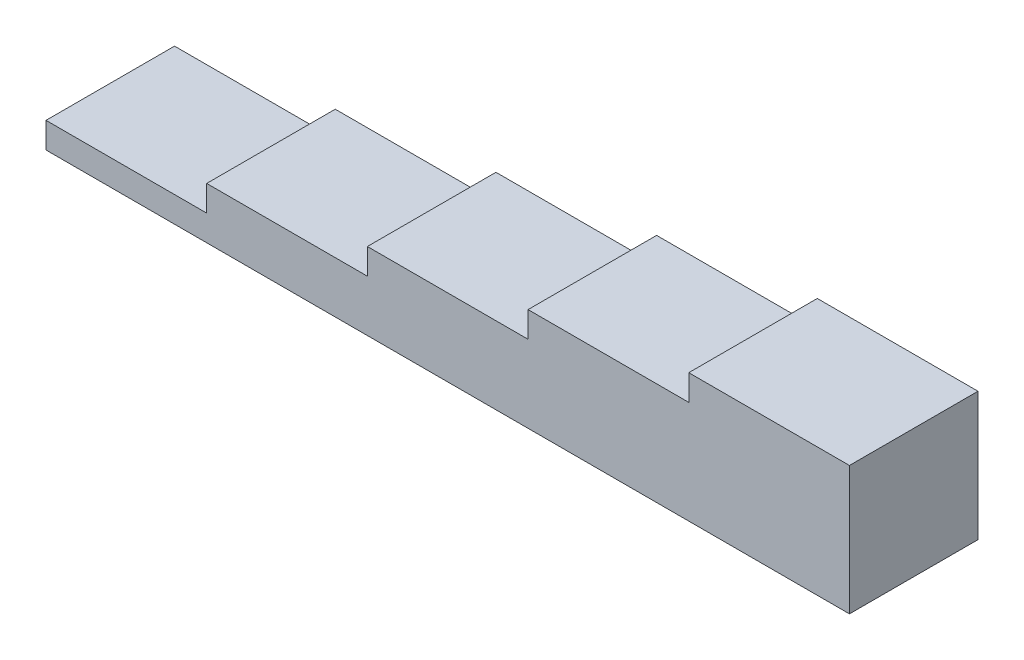
ISO-10303-21;
HEADER;
FILE_DESCRIPTION(('STEP AP214'),'2;1');
FILE_NAME('part.step','',(''),(''),'','','');
FILE_SCHEMA(('AUTOMOTIVE_DESIGN { 1 0 10303 214 1 1 1 1 }'));
ENDSEC;
DATA;
#1=APPLICATION_CONTEXT('core data for automotive mechanical design processes');
#2=APPLICATION_PROTOCOL_DEFINITION('international standard','automotive_design',2000,#1);
#3=PRODUCT_CONTEXT('',#1,'mechanical');
#4=PRODUCT('Part','Part','',(#3));
#5=PRODUCT_RELATED_PRODUCT_CATEGORY('part','',(#4));
#6=PRODUCT_DEFINITION_FORMATION('','',#4);
#7=PRODUCT_DEFINITION_CONTEXT('part definition',#1,'design');
#8=PRODUCT_DEFINITION('design','',#6,#7);
#9=PRODUCT_DEFINITION_SHAPE('','',#8);
#10=(LENGTH_UNIT() NAMED_UNIT(*) SI_UNIT(.MILLI.,.METRE.));
#11=(NAMED_UNIT(*) PLANE_ANGLE_UNIT() SI_UNIT($,.RADIAN.));
#12=(NAMED_UNIT(*) SI_UNIT($,.STERADIAN.) SOLID_ANGLE_UNIT());
#13=UNCERTAINTY_MEASURE_WITH_UNIT(LENGTH_MEASURE(1.E-05),#10,'distance_accuracy_value','');
#14=(GEOMETRIC_REPRESENTATION_CONTEXT(3) GLOBAL_UNCERTAINTY_ASSIGNED_CONTEXT((#13)) GLOBAL_UNIT_ASSIGNED_CONTEXT((#10,
#11,#12)) REPRESENTATION_CONTEXT('',''));
#15=CARTESIAN_POINT('',(0.,0.,0.));
#16=DIRECTION('',(0.,0.,1.));
#17=DIRECTION('',(1.,0.,0.));
#18=AXIS2_PLACEMENT_3D('',#15,#16,#17);
#19=CARTESIAN_POINT('',(1250.,200.,200.));
#20=DIRECTION('',(1.,0.,0.));
#21=DIRECTION('',(0.,0.,-1.));
#22=AXIS2_PLACEMENT_3D('',#19,#20,#21);
#23=PLANE('',#22);
#24=DIRECTION('',(0.,-1.,0.));
#25=VECTOR('',#24,1.);
#26=CARTESIAN_POINT('',(1250.,200.,0.));
#27=LINE('',#26,#25);
#28=CARTESIAN_POINT('',(1250.,200.,0.));
#29=VERTEX_POINT('',#28);
#30=CARTESIAN_POINT('',(1250.,0.,0.));
#31=VERTEX_POINT('',#30);
#32=EDGE_CURVE('E156',#29,#31,#27,.T.);
#33=ORIENTED_EDGE('',*,*,#32,.F.);
#34=DIRECTION('',(0.,0.,-1.));
#35=VECTOR('',#34,1.);
#36=CARTESIAN_POINT('',(1250.,200.,200.));
#37=LINE('',#36,#35);
#38=CARTESIAN_POINT('',(1250.,200.,200.));
#39=VERTEX_POINT('',#38);
#40=EDGE_CURVE('E11',#39,#29,#37,.T.);
#41=ORIENTED_EDGE('',*,*,#40,.F.);
#42=DIRECTION('',(0.,-1.,0.));
#43=VECTOR('',#42,1.);
#44=CARTESIAN_POINT('',(1250.,200.,200.));
#45=LINE('',#44,#43);
#46=CARTESIAN_POINT('',(1250.,0.,200.));
#47=VERTEX_POINT('',#46);
#48=EDGE_CURVE('E188',#39,#47,#45,.T.);
#49=ORIENTED_EDGE('',*,*,#48,.T.);
#50=DIRECTION('',(0.,0.,-1.));
#51=VECTOR('',#50,1.);
#52=CARTESIAN_POINT('',(1250.,0.,200.));
#53=LINE('',#52,#51);
#54=EDGE_CURVE('E38',#47,#31,#53,.T.);
#55=ORIENTED_EDGE('',*,*,#54,.T.);
#56=EDGE_LOOP('',(#33,#41,#49,#55));
#57=FACE_BOUND('',#56,.T.);
#58=ADVANCED_FACE('F35',(#57),#23,.T.);
#59=CARTESIAN_POINT('',(1000.,200.,200.));
#60=DIRECTION('',(0.,1.,0.));
#61=DIRECTION('',(0.,0.,1.));
#62=AXIS2_PLACEMENT_3D('',#59,#60,#61);
#63=PLANE('',#62);
#64=DIRECTION('',(1.,0.,0.));
#65=VECTOR('',#64,1.);
#66=CARTESIAN_POINT('',(1000.,200.,0.));
#67=LINE('',#66,#65);
#68=CARTESIAN_POINT('',(1000.,200.,0.));
#69=VERTEX_POINT('',#68);
#70=EDGE_CURVE('E186',#69,#29,#67,.T.);
#71=ORIENTED_EDGE('',*,*,#70,.F.);
#72=DIRECTION('',(0.,0.,-1.));
#73=VECTOR('',#72,1.);
#74=CARTESIAN_POINT('',(1000.,200.,200.));
#75=LINE('',#74,#73);
#76=CARTESIAN_POINT('',(1000.,200.,200.));
#77=VERTEX_POINT('',#76);
#78=EDGE_CURVE('E44',#77,#69,#75,.T.);
#79=ORIENTED_EDGE('',*,*,#78,.F.);
#80=DIRECTION('',(1.,0.,0.));
#81=VECTOR('',#80,1.);
#82=CARTESIAN_POINT('',(1000.,200.,200.));
#83=LINE('',#82,#81);
#84=EDGE_CURVE('E146',#77,#39,#83,.T.);
#85=ORIENTED_EDGE('',*,*,#84,.T.);
#86=ORIENTED_EDGE('',*,*,#40,.T.);
#87=EDGE_LOOP('',(#71,#79,#85,#86));
#88=FACE_BOUND('',#87,.T.);
#89=ADVANCED_FACE('F208',(#88),#63,.T.);
#90=CARTESIAN_POINT('',(1000.,160.,200.));
#91=DIRECTION('',(-1.,0.,0.));
#92=DIRECTION('',(0.,0.,1.));
#93=AXIS2_PLACEMENT_3D('',#90,#91,#92);
#94=PLANE('',#93);
#95=DIRECTION('',(0.,1.,0.));
#96=VECTOR('',#95,1.);
#97=CARTESIAN_POINT('',(1000.,160.,0.));
#98=LINE('',#97,#96);
#99=CARTESIAN_POINT('',(1000.,160.,0.));
#100=VERTEX_POINT('',#99);
#101=EDGE_CURVE('E133',#100,#69,#98,.T.);
#102=ORIENTED_EDGE('',*,*,#101,.F.);
#103=DIRECTION('',(0.,0.,-1.));
#104=VECTOR('',#103,1.);
#105=CARTESIAN_POINT('',(1000.,160.,200.));
#106=LINE('',#105,#104);
#107=CARTESIAN_POINT('',(1000.,160.,200.));
#108=VERTEX_POINT('',#107);
#109=EDGE_CURVE('E128',#108,#100,#106,.T.);
#110=ORIENTED_EDGE('',*,*,#109,.F.);
#111=DIRECTION('',(0.,1.,0.));
#112=VECTOR('',#111,1.);
#113=CARTESIAN_POINT('',(1000.,160.,200.));
#114=LINE('',#113,#112);
#115=EDGE_CURVE('E131',#108,#77,#114,.T.);
#116=ORIENTED_EDGE('',*,*,#115,.T.);
#117=ORIENTED_EDGE('',*,*,#78,.T.);
#118=EDGE_LOOP('',(#102,#110,#116,#117));
#119=FACE_BOUND('',#118,.T.);
#120=ADVANCED_FACE('F130',(#119),#94,.T.);
#121=CARTESIAN_POINT('',(750.,160.,200.));
#122=DIRECTION('',(0.,1.,0.));
#123=DIRECTION('',(0.,0.,1.));
#124=AXIS2_PLACEMENT_3D('',#121,#122,#123);
#125=PLANE('',#124);
#126=DIRECTION('',(1.,0.,0.));
#127=VECTOR('',#126,1.);
#128=CARTESIAN_POINT('',(750.,160.,0.));
#129=LINE('',#128,#127);
#130=CARTESIAN_POINT('',(750.,160.,0.));
#131=VERTEX_POINT('',#130);
#132=EDGE_CURVE('E183',#131,#100,#129,.T.);
#133=ORIENTED_EDGE('',*,*,#132,.F.);
#134=DIRECTION('',(0.,0.,-1.));
#135=VECTOR('',#134,1.);
#136=CARTESIAN_POINT('',(750.,160.,200.));
#137=LINE('',#136,#135);
#138=CARTESIAN_POINT('',(750.,160.,200.));
#139=VERTEX_POINT('',#138);
#140=EDGE_CURVE('E138',#139,#131,#137,.T.);
#141=ORIENTED_EDGE('',*,*,#140,.F.);
#142=DIRECTION('',(1.,0.,0.));
#143=VECTOR('',#142,1.);
#144=CARTESIAN_POINT('',(750.,160.,200.));
#145=LINE('',#144,#143);
#146=EDGE_CURVE('E144',#139,#108,#145,.T.);
#147=ORIENTED_EDGE('',*,*,#146,.T.);
#148=ORIENTED_EDGE('',*,*,#109,.T.);
#149=EDGE_LOOP('',(#133,#141,#147,#148));
#150=FACE_BOUND('',#149,.T.);
#151=ADVANCED_FACE('F148',(#150),#125,.T.);
#152=CARTESIAN_POINT('',(750.,120.,200.));
#153=DIRECTION('',(-1.,0.,0.));
#154=DIRECTION('',(0.,0.,1.));
#155=AXIS2_PLACEMENT_3D('',#152,#153,#154);
#156=PLANE('',#155);
#157=DIRECTION('',(0.,1.,0.));
#158=VECTOR('',#157,1.);
#159=CARTESIAN_POINT('',(750.,120.,0.));
#160=LINE('',#159,#158);
#161=CARTESIAN_POINT('',(750.,120.,0.));
#162=VERTEX_POINT('',#161);
#163=EDGE_CURVE('E180',#162,#131,#160,.T.);
#164=ORIENTED_EDGE('',*,*,#163,.F.);
#165=DIRECTION('',(0.,0.,-1.));
#166=VECTOR('',#165,1.);
#167=CARTESIAN_POINT('',(750.,120.,200.));
#168=LINE('',#167,#166);
#169=CARTESIAN_POINT('',(750.,120.,200.));
#170=VERTEX_POINT('',#169);
#171=EDGE_CURVE('E192',#170,#162,#168,.T.);
#172=ORIENTED_EDGE('',*,*,#171,.F.);
#173=DIRECTION('',(0.,1.,0.));
#174=VECTOR('',#173,1.);
#175=CARTESIAN_POINT('',(750.,120.,200.));
#176=LINE('',#175,#174);
#177=EDGE_CURVE('E149',#170,#139,#176,.T.);
#178=ORIENTED_EDGE('',*,*,#177,.T.);
#179=ORIENTED_EDGE('',*,*,#140,.T.);
#180=EDGE_LOOP('',(#164,#172,#178,#179));
#181=FACE_BOUND('',#180,.T.);
#182=ADVANCED_FACE('F221',(#181),#156,.T.);
#183=CARTESIAN_POINT('',(500.,120.,200.));
#184=DIRECTION('',(0.,1.,0.));
#185=DIRECTION('',(0.,0.,1.));
#186=AXIS2_PLACEMENT_3D('',#183,#184,#185);
#187=PLANE('',#186);
#188=DIRECTION('',(1.,0.,0.));
#189=VECTOR('',#188,1.);
#190=CARTESIAN_POINT('',(500.,120.,0.));
#191=LINE('',#190,#189);
#192=CARTESIAN_POINT('',(500.,120.,0.));
#193=VERTEX_POINT('',#192);
#194=EDGE_CURVE('E177',#193,#162,#191,.T.);
#195=ORIENTED_EDGE('',*,*,#194,.F.);
#196=DIRECTION('',(0.,0.,-1.));
#197=VECTOR('',#196,1.);
#198=CARTESIAN_POINT('',(500.,120.,200.));
#199=LINE('',#198,#197);
#200=CARTESIAN_POINT('',(500.,120.,200.));
#201=VERTEX_POINT('',#200);
#202=EDGE_CURVE('E194',#201,#193,#199,.T.);
#203=ORIENTED_EDGE('',*,*,#202,.F.);
#204=DIRECTION('',(1.,0.,0.));
#205=VECTOR('',#204,1.);
#206=CARTESIAN_POINT('',(500.,120.,200.));
#207=LINE('',#206,#205);
#208=EDGE_CURVE('E151',#201,#170,#207,.T.);
#209=ORIENTED_EDGE('',*,*,#208,.T.);
#210=ORIENTED_EDGE('',*,*,#171,.T.);
#211=EDGE_LOOP('',(#195,#203,#209,#210));
#212=FACE_BOUND('',#211,.T.);
#213=ADVANCED_FACE('F224',(#212),#187,.T.);
#214=CARTESIAN_POINT('',(500.,80.,200.));
#215=DIRECTION('',(-1.,0.,0.));
#216=DIRECTION('',(0.,0.,1.));
#217=AXIS2_PLACEMENT_3D('',#214,#215,#216);
#218=PLANE('',#217);
#219=DIRECTION('',(0.,1.,0.));
#220=VECTOR('',#219,1.);
#221=CARTESIAN_POINT('',(500.,80.,0.));
#222=LINE('',#221,#220);
#223=CARTESIAN_POINT('',(500.,80.,0.));
#224=VERTEX_POINT('',#223);
#225=EDGE_CURVE('E174',#224,#193,#222,.T.);
#226=ORIENTED_EDGE('',*,*,#225,.F.);
#227=DIRECTION('',(0.,0.,-1.));
#228=VECTOR('',#227,1.);
#229=CARTESIAN_POINT('',(500.,80.,200.));
#230=LINE('',#229,#228);
#231=CARTESIAN_POINT('',(500.,80.,200.));
#232=VERTEX_POINT('',#231);
#233=EDGE_CURVE('E196',#232,#224,#230,.T.);
#234=ORIENTED_EDGE('',*,*,#233,.F.);
#235=DIRECTION('',(0.,1.,0.));
#236=VECTOR('',#235,1.);
#237=CARTESIAN_POINT('',(500.,80.,200.));
#238=LINE('',#237,#236);
#239=EDGE_CURVE('E350',#232,#201,#238,.T.);
#240=ORIENTED_EDGE('',*,*,#239,.T.);
#241=ORIENTED_EDGE('',*,*,#202,.T.);
#242=EDGE_LOOP('',(#226,#234,#240,#241));
#243=FACE_BOUND('',#242,.T.);
#244=ADVANCED_FACE('F228',(#243),#218,.T.);
#245=CARTESIAN_POINT('',(250.,80.,200.));
#246=DIRECTION('',(0.,1.,0.));
#247=DIRECTION('',(0.,0.,1.));
#248=AXIS2_PLACEMENT_3D('',#245,#246,#247);
#249=PLANE('',#248);
#250=DIRECTION('',(1.,0.,0.));
#251=VECTOR('',#250,1.);
#252=CARTESIAN_POINT('',(250.,80.,0.));
#253=LINE('',#252,#251);
#254=CARTESIAN_POINT('',(250.,80.,0.));
#255=VERTEX_POINT('',#254);
#256=EDGE_CURVE('E171',#255,#224,#253,.T.);
#257=ORIENTED_EDGE('',*,*,#256,.F.);
#258=DIRECTION('',(0.,0.,-1.));
#259=VECTOR('',#258,1.);
#260=CARTESIAN_POINT('',(250.,80.,200.));
#261=LINE('',#260,#259);
#262=CARTESIAN_POINT('',(250.,80.,200.));
#263=VERTEX_POINT('',#262);
#264=EDGE_CURVE('E198',#263,#255,#261,.T.);
#265=ORIENTED_EDGE('',*,*,#264,.F.);
#266=DIRECTION('',(1.,0.,0.));
#267=VECTOR('',#266,1.);
#268=CARTESIAN_POINT('',(250.,80.,200.));
#269=LINE('',#268,#267);
#270=EDGE_CURVE('E354',#263,#232,#269,.T.);
#271=ORIENTED_EDGE('',*,*,#270,.T.);
#272=ORIENTED_EDGE('',*,*,#233,.T.);
#273=EDGE_LOOP('',(#257,#265,#271,#272));
#274=FACE_BOUND('',#273,.T.);
#275=ADVANCED_FACE('F232',(#274),#249,.T.);
#276=CARTESIAN_POINT('',(250.,40.,200.));
#277=DIRECTION('',(-1.,0.,0.));
#278=DIRECTION('',(0.,0.,1.));
#279=AXIS2_PLACEMENT_3D('',#276,#277,#278);
#280=PLANE('',#279);
#281=DIRECTION('',(0.,1.,0.));
#282=VECTOR('',#281,1.);
#283=CARTESIAN_POINT('',(250.,40.,0.));
#284=LINE('',#283,#282);
#285=CARTESIAN_POINT('',(250.,40.,0.));
#286=VERTEX_POINT('',#285);
#287=EDGE_CURVE('E168',#286,#255,#284,.T.);
#288=ORIENTED_EDGE('',*,*,#287,.F.);
#289=DIRECTION('',(0.,0.,-1.));
#290=VECTOR('',#289,1.);
#291=CARTESIAN_POINT('',(250.,40.,200.));
#292=LINE('',#291,#290);
#293=CARTESIAN_POINT('',(250.,40.,200.));
#294=VERTEX_POINT('',#293);
#295=EDGE_CURVE('E200',#294,#286,#292,.T.);
#296=ORIENTED_EDGE('',*,*,#295,.F.);
#297=DIRECTION('',(0.,1.,0.));
#298=VECTOR('',#297,1.);
#299=CARTESIAN_POINT('',(250.,40.,200.));
#300=LINE('',#299,#298);
#301=EDGE_CURVE('E343',#294,#263,#300,.T.);
#302=ORIENTED_EDGE('',*,*,#301,.T.);
#303=ORIENTED_EDGE('',*,*,#264,.T.);
#304=EDGE_LOOP('',(#288,#296,#302,#303));
#305=FACE_BOUND('',#304,.T.);
#306=ADVANCED_FACE('F236',(#305),#280,.T.);
#307=CARTESIAN_POINT('',(0.,40.,200.));
#308=DIRECTION('',(0.,1.,0.));
#309=DIRECTION('',(0.,0.,1.));
#310=AXIS2_PLACEMENT_3D('',#307,#308,#309);
#311=PLANE('',#310);
#312=DIRECTION('',(1.,0.,0.));
#313=VECTOR('',#312,1.);
#314=CARTESIAN_POINT('',(0.,40.,0.));
#315=LINE('',#314,#313);
#316=CARTESIAN_POINT('',(0.,40.,0.));
#317=VERTEX_POINT('',#316);
#318=EDGE_CURVE('E165',#317,#286,#315,.T.);
#319=ORIENTED_EDGE('',*,*,#318,.F.);
#320=DIRECTION('',(0.,0.,-1.));
#321=VECTOR('',#320,1.);
#322=CARTESIAN_POINT('',(0.,40.,200.));
#323=LINE('',#322,#321);
#324=CARTESIAN_POINT('',(0.,40.,200.));
#325=VERTEX_POINT('',#324);
#326=EDGE_CURVE('E202',#325,#317,#323,.T.);
#327=ORIENTED_EDGE('',*,*,#326,.F.);
#328=DIRECTION('',(1.,0.,0.));
#329=VECTOR('',#328,1.);
#330=CARTESIAN_POINT('',(0.,40.,200.));
#331=LINE('',#330,#329);
#332=EDGE_CURVE('E339',#325,#294,#331,.T.);
#333=ORIENTED_EDGE('',*,*,#332,.T.);
#334=ORIENTED_EDGE('',*,*,#295,.T.);
#335=EDGE_LOOP('',(#319,#327,#333,#334));
#336=FACE_BOUND('',#335,.T.);
#337=ADVANCED_FACE('F240',(#336),#311,.T.);
#338=CARTESIAN_POINT('',(0.,0.,200.));
#339=DIRECTION('',(-1.,0.,0.));
#340=DIRECTION('',(0.,0.,1.));
#341=AXIS2_PLACEMENT_3D('',#338,#339,#340);
#342=PLANE('',#341);
#343=DIRECTION('',(0.,1.,0.));
#344=VECTOR('',#343,1.);
#345=CARTESIAN_POINT('',(0.,0.,0.));
#346=LINE('',#345,#344);
#347=CARTESIAN_POINT('',(0.,0.,0.));
#348=VERTEX_POINT('',#347);
#349=EDGE_CURVE('E162',#348,#317,#346,.T.);
#350=ORIENTED_EDGE('',*,*,#349,.F.);
#351=DIRECTION('',(0.,0.,-1.));
#352=VECTOR('',#351,1.);
#353=CARTESIAN_POINT('',(0.,0.,200.));
#354=LINE('',#353,#352);
#355=CARTESIAN_POINT('',(0.,0.,200.));
#356=VERTEX_POINT('',#355);
#357=EDGE_CURVE('E203',#356,#348,#354,.T.);
#358=ORIENTED_EDGE('',*,*,#357,.F.);
#359=DIRECTION('',(0.,1.,0.));
#360=VECTOR('',#359,1.);
#361=CARTESIAN_POINT('',(0.,0.,200.));
#362=LINE('',#361,#360);
#363=EDGE_CURVE('E360',#356,#325,#362,.T.);
#364=ORIENTED_EDGE('',*,*,#363,.T.);
#365=ORIENTED_EDGE('',*,*,#326,.T.);
#366=EDGE_LOOP('',(#350,#358,#364,#365));
#367=FACE_BOUND('',#366,.T.);
#368=ADVANCED_FACE('F244',(#367),#342,.T.);
#369=CARTESIAN_POINT('',(1250.,0.,200.));
#370=DIRECTION('',(0.,-1.,0.));
#371=DIRECTION('',(1.,0.,0.));
#372=AXIS2_PLACEMENT_3D('',#369,#370,#371);
#373=PLANE('',#372);
#374=DIRECTION('',(-1.,0.,0.));
#375=VECTOR('',#374,1.);
#376=CARTESIAN_POINT('',(1250.,0.,0.));
#377=LINE('',#376,#375);
#378=EDGE_CURVE('E159',#31,#348,#377,.T.);
#379=ORIENTED_EDGE('',*,*,#378,.F.);
#380=ORIENTED_EDGE('',*,*,#54,.F.);
#381=DIRECTION('',(-1.,0.,0.));
#382=VECTOR('',#381,1.);
#383=CARTESIAN_POINT('',(1250.,0.,200.));
#384=LINE('',#383,#382);
#385=EDGE_CURVE('E362',#47,#356,#384,.T.);
#386=ORIENTED_EDGE('',*,*,#385,.T.);
#387=ORIENTED_EDGE('',*,*,#357,.T.);
#388=EDGE_LOOP('',(#379,#380,#386,#387));
#389=FACE_BOUND('',#388,.T.);
#390=ADVANCED_FACE('F205',(#389),#373,.T.);
#391=CARTESIAN_POINT('',(0.,0.,200.));
#392=DIRECTION('',(0.,0.,-1.));
#393=DIRECTION('',(-1.,0.,0.));
#394=AXIS2_PLACEMENT_3D('',#391,#392,#393);
#395=PLANE('',#394);
#396=ORIENTED_EDGE('',*,*,#48,.F.);
#397=ORIENTED_EDGE('',*,*,#84,.F.);
#398=ORIENTED_EDGE('',*,*,#115,.F.);
#399=ORIENTED_EDGE('',*,*,#146,.F.);
#400=ORIENTED_EDGE('',*,*,#177,.F.);
#401=ORIENTED_EDGE('',*,*,#208,.F.);
#402=ORIENTED_EDGE('',*,*,#239,.F.);
#403=ORIENTED_EDGE('',*,*,#270,.F.);
#404=ORIENTED_EDGE('',*,*,#301,.F.);
#405=ORIENTED_EDGE('',*,*,#332,.F.);
#406=ORIENTED_EDGE('',*,*,#363,.F.);
#407=ORIENTED_EDGE('',*,*,#385,.F.);
#408=EDGE_LOOP('',(#396,#397,#398,#399,#400,#401,#402,#403,#404,#405,#406,#407));
#409=FACE_BOUND('',#408,.T.);
#410=ADVANCED_FACE('F142',(#409),#395,.F.);
#411=CARTESIAN_POINT('',(0.,0.,0.));
#412=DIRECTION('',(0.,0.,-1.));
#413=DIRECTION('',(-1.,0.,0.));
#414=AXIS2_PLACEMENT_3D('',#411,#412,#413);
#415=PLANE('',#414);
#416=ORIENTED_EDGE('',*,*,#32,.T.);
#417=ORIENTED_EDGE('',*,*,#378,.T.);
#418=ORIENTED_EDGE('',*,*,#349,.T.);
#419=ORIENTED_EDGE('',*,*,#318,.T.);
#420=ORIENTED_EDGE('',*,*,#287,.T.);
#421=ORIENTED_EDGE('',*,*,#256,.T.);
#422=ORIENTED_EDGE('',*,*,#225,.T.);
#423=ORIENTED_EDGE('',*,*,#194,.T.);
#424=ORIENTED_EDGE('',*,*,#163,.T.);
#425=ORIENTED_EDGE('',*,*,#132,.T.);
#426=ORIENTED_EDGE('',*,*,#101,.T.);
#427=ORIENTED_EDGE('',*,*,#70,.T.);
#428=EDGE_LOOP('',(#416,#417,#418,#419,#420,#421,#422,#423,#424,#425,#426,#427));
#429=FACE_BOUND('',#428,.T.);
#430=ADVANCED_FACE('F207',(#429),#415,.T.);
#431=CLOSED_SHELL('',(#58,#89,#120,#151,#182,#213,#244,#275,#306,#337,#368,#390,#410,#430));
#432=MANIFOLD_SOLID_BREP('B2',#431);
#433=ADVANCED_BREP_SHAPE_REPRESENTATION('',(#18,#432),#14);
#434=SHAPE_DEFINITION_REPRESENTATION(#9,#433);
ENDSEC;
END-ISO-10303-21;
